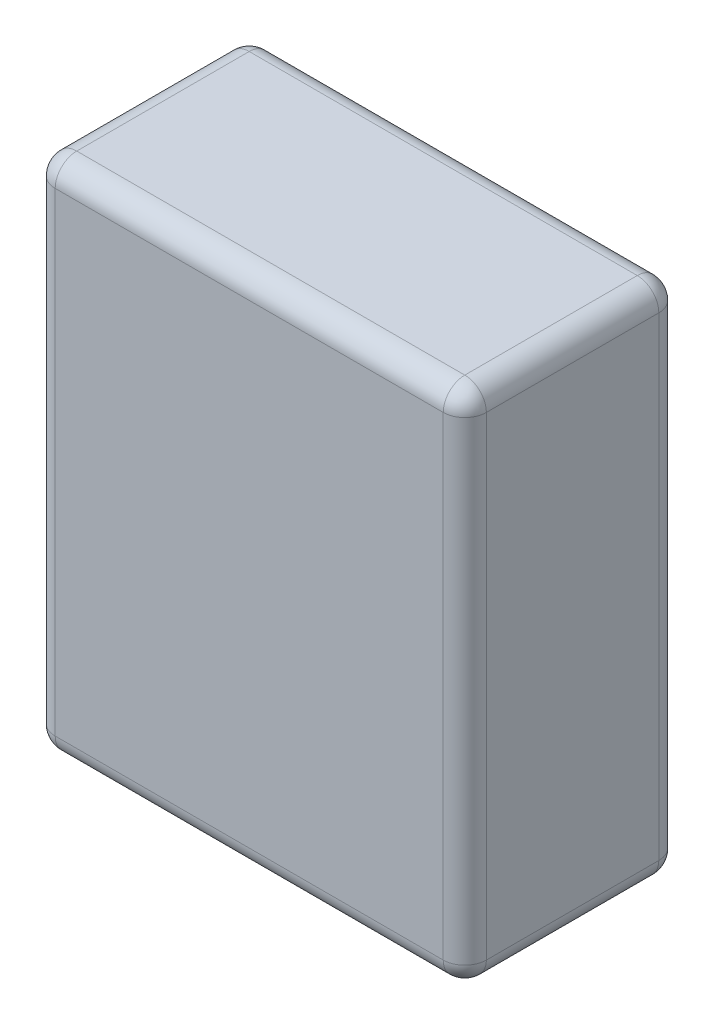
ISO-10303-21;
HEADER;
FILE_DESCRIPTION(('STEP AP214'),'2;1');
FILE_NAME('part.step','',(''),(''),'','','');
FILE_SCHEMA(('AUTOMOTIVE_DESIGN { 1 0 10303 214 1 1 1 1 }'));
ENDSEC;
DATA;
#1=APPLICATION_CONTEXT('core data for automotive mechanical design processes');
#2=APPLICATION_PROTOCOL_DEFINITION('international standard','automotive_design',2000,#1);
#3=PRODUCT_CONTEXT('',#1,'mechanical');
#4=PRODUCT('Part','Part','',(#3));
#5=PRODUCT_RELATED_PRODUCT_CATEGORY('part','',(#4));
#6=PRODUCT_DEFINITION_FORMATION('','',#4);
#7=PRODUCT_DEFINITION_CONTEXT('part definition',#1,'design');
#8=PRODUCT_DEFINITION('design','',#6,#7);
#9=PRODUCT_DEFINITION_SHAPE('','',#8);
#10=(LENGTH_UNIT() NAMED_UNIT(*) SI_UNIT(.MILLI.,.METRE.));
#11=(NAMED_UNIT(*) PLANE_ANGLE_UNIT() SI_UNIT($,.RADIAN.));
#12=(NAMED_UNIT(*) SI_UNIT($,.STERADIAN.) SOLID_ANGLE_UNIT());
#13=UNCERTAINTY_MEASURE_WITH_UNIT(LENGTH_MEASURE(1.E-05),#10,'distance_accuracy_value','');
#14=(GEOMETRIC_REPRESENTATION_CONTEXT(3) GLOBAL_UNCERTAINTY_ASSIGNED_CONTEXT((#13)) GLOBAL_UNIT_ASSIGNED_CONTEXT((#10,
#11,#12)) REPRESENTATION_CONTEXT('',''));
#15=CARTESIAN_POINT('',(0.,0.,0.));
#16=DIRECTION('',(0.,0.,1.));
#17=DIRECTION('',(1.,0.,0.));
#18=AXIS2_PLACEMENT_3D('',#15,#16,#17);
#19=CARTESIAN_POINT('',(5.,6.,5.));
#20=DIRECTION('',(-1.,0.,0.));
#21=DIRECTION('',(0.,0.,1.));
#22=AXIS2_PLACEMENT_3D('',#19,#20,#21);
#23=PLANE('',#22);
#24=DIRECTION('',(0.,1.,0.));
#25=VECTOR('',#24,1.);
#26=CARTESIAN_POINT('',(5.,-6.,4.5));
#27=LINE('',#26,#25);
#28=CARTESIAN_POINT('',(5.,5.5,4.5));
#29=VERTEX_POINT('',#28);
#30=CARTESIAN_POINT('',(5.,-5.5,4.5));
#31=VERTEX_POINT('',#30);
#32=EDGE_CURVE('E195',#29,#31,#27,.F.);
#33=ORIENTED_EDGE('',*,*,#32,.T.);
#34=DIRECTION('',(0.,0.,-1.));
#35=VECTOR('',#34,1.);
#36=CARTESIAN_POINT('',(5.,-5.5,5.));
#37=LINE('',#36,#35);
#38=CARTESIAN_POINT('',(5.,-5.5,0.5));
#39=VERTEX_POINT('',#38);
#40=EDGE_CURVE('E149',#31,#39,#37,.T.);
#41=ORIENTED_EDGE('',*,*,#40,.T.);
#42=DIRECTION('',(0.,1.,0.));
#43=VECTOR('',#42,1.);
#44=CARTESIAN_POINT('',(5.,6.,0.5));
#45=LINE('',#44,#43);
#46=CARTESIAN_POINT('',(5.,5.5,0.5));
#47=VERTEX_POINT('',#46);
#48=EDGE_CURVE('E197',#39,#47,#45,.T.);
#49=ORIENTED_EDGE('',*,*,#48,.T.);
#50=DIRECTION('',(0.,0.,-1.));
#51=VECTOR('',#50,1.);
#52=CARTESIAN_POINT('',(5.,5.5,5.));
#53=LINE('',#52,#51);
#54=EDGE_CURVE('E193',#47,#29,#53,.F.);
#55=ORIENTED_EDGE('',*,*,#54,.T.);
#56=EDGE_LOOP('',(#33,#41,#49,#55));
#57=FACE_BOUND('',#56,.T.);
#58=ADVANCED_FACE('F43',(#57),#23,.F.);
#59=CARTESIAN_POINT('',(-5.,6.,5.));
#60=DIRECTION('',(0.,-1.,0.));
#61=DIRECTION('',(0.,0.,-1.));
#62=AXIS2_PLACEMENT_3D('',#59,#60,#61);
#63=PLANE('',#62);
#64=DIRECTION('',(-1.,0.,0.));
#65=VECTOR('',#64,1.);
#66=CARTESIAN_POINT('',(5.,6.,4.5));
#67=LINE('',#66,#65);
#68=CARTESIAN_POINT('',(-4.5,6.,4.5));
#69=VERTEX_POINT('',#68);
#70=CARTESIAN_POINT('',(4.5,6.,4.5));
#71=VERTEX_POINT('',#70);
#72=EDGE_CURVE('E52',#69,#71,#67,.F.);
#73=ORIENTED_EDGE('',*,*,#72,.T.);
#74=DIRECTION('',(0.,0.,-1.));
#75=VECTOR('',#74,1.);
#76=CARTESIAN_POINT('',(4.5,6.,5.));
#77=LINE('',#76,#75);
#78=CARTESIAN_POINT('',(4.5,6.,0.5));
#79=VERTEX_POINT('',#78);
#80=EDGE_CURVE('E11',#71,#79,#77,.T.);
#81=ORIENTED_EDGE('',*,*,#80,.T.);
#82=DIRECTION('',(-1.,0.,0.));
#83=VECTOR('',#82,1.);
#84=CARTESIAN_POINT('',(-5.,6.,0.5));
#85=LINE('',#84,#83);
#86=CARTESIAN_POINT('',(-4.5,6.,0.5));
#87=VERTEX_POINT('',#86);
#88=EDGE_CURVE('E209',#79,#87,#85,.T.);
#89=ORIENTED_EDGE('',*,*,#88,.T.);
#90=DIRECTION('',(0.,0.,-1.));
#91=VECTOR('',#90,1.);
#92=CARTESIAN_POINT('',(-4.5,6.,5.));
#93=LINE('',#92,#91);
#94=EDGE_CURVE('E63',#87,#69,#93,.F.);
#95=ORIENTED_EDGE('',*,*,#94,.T.);
#96=EDGE_LOOP('',(#73,#81,#89,#95));
#97=FACE_BOUND('',#96,.T.);
#98=ADVANCED_FACE('F282',(#97),#63,.F.);
#99=CARTESIAN_POINT('',(-5.,6.,5.));
#100=DIRECTION('',(1.,0.,0.));
#101=DIRECTION('',(0.,1.,0.));
#102=AXIS2_PLACEMENT_3D('',#99,#100,#101);
#103=PLANE('',#102);
#104=DIRECTION('',(0.,-1.,0.));
#105=VECTOR('',#104,1.);
#106=CARTESIAN_POINT('',(-5.,6.,0.5));
#107=LINE('',#106,#105);
#108=CARTESIAN_POINT('',(-5.,5.5,0.5));
#109=VERTEX_POINT('',#108);
#110=CARTESIAN_POINT('',(-5.,-5.5,0.5));
#111=VERTEX_POINT('',#110);
#112=EDGE_CURVE('E179',#109,#111,#107,.T.);
#113=ORIENTED_EDGE('',*,*,#112,.T.);
#114=DIRECTION('',(0.,0.,-1.));
#115=VECTOR('',#114,1.);
#116=CARTESIAN_POINT('',(-5.,-5.5,5.));
#117=LINE('',#116,#115);
#118=CARTESIAN_POINT('',(-5.,-5.5,4.5));
#119=VERTEX_POINT('',#118);
#120=EDGE_CURVE('E181',#111,#119,#117,.F.);
#121=ORIENTED_EDGE('',*,*,#120,.T.);
#122=DIRECTION('',(0.,-1.,0.));
#123=VECTOR('',#122,1.);
#124=CARTESIAN_POINT('',(-5.,6.,4.5));
#125=LINE('',#124,#123);
#126=CARTESIAN_POINT('',(-5.,5.5,4.5));
#127=VERTEX_POINT('',#126);
#128=EDGE_CURVE('E177',#119,#127,#125,.F.);
#129=ORIENTED_EDGE('',*,*,#128,.T.);
#130=DIRECTION('',(0.,0.,-1.));
#131=VECTOR('',#130,1.);
#132=CARTESIAN_POINT('',(-5.,5.5,5.));
#133=LINE('',#132,#131);
#134=EDGE_CURVE('E175',#127,#109,#133,.T.);
#135=ORIENTED_EDGE('',*,*,#134,.T.);
#136=EDGE_LOOP('',(#113,#121,#129,#135));
#137=FACE_BOUND('',#136,.T.);
#138=ADVANCED_FACE('F342',(#137),#103,.F.);
#139=CARTESIAN_POINT('',(-5.,-6.,5.));
#140=DIRECTION('',(0.,1.,0.));
#141=DIRECTION('',(0.,0.,1.));
#142=AXIS2_PLACEMENT_3D('',#139,#140,#141);
#143=PLANE('',#142);
#144=DIRECTION('',(1.,0.,0.));
#145=VECTOR('',#144,1.);
#146=CARTESIAN_POINT('',(-5.,-6.,4.5));
#147=LINE('',#146,#145);
#148=CARTESIAN_POINT('',(4.5,-6.,4.5));
#149=VERTEX_POINT('',#148);
#150=CARTESIAN_POINT('',(-4.5,-6.,4.5));
#151=VERTEX_POINT('',#150);
#152=EDGE_CURVE('E135',#149,#151,#147,.F.);
#153=ORIENTED_EDGE('',*,*,#152,.T.);
#154=DIRECTION('',(0.,0.,-1.));
#155=VECTOR('',#154,1.);
#156=CARTESIAN_POINT('',(-4.5,-6.,5.));
#157=LINE('',#156,#155);
#158=CARTESIAN_POINT('',(-4.5,-6.,0.5));
#159=VERTEX_POINT('',#158);
#160=EDGE_CURVE('E173',#151,#159,#157,.T.);
#161=ORIENTED_EDGE('',*,*,#160,.T.);
#162=DIRECTION('',(1.,0.,0.));
#163=VECTOR('',#162,1.);
#164=CARTESIAN_POINT('',(-5.,-6.,0.5));
#165=LINE('',#164,#163);
#166=CARTESIAN_POINT('',(4.5,-6.,0.5));
#167=VERTEX_POINT('',#166);
#168=EDGE_CURVE('E138',#159,#167,#165,.T.);
#169=ORIENTED_EDGE('',*,*,#168,.T.);
#170=DIRECTION('',(0.,0.,-1.));
#171=VECTOR('',#170,1.);
#172=CARTESIAN_POINT('',(4.5,-6.,5.));
#173=LINE('',#172,#171);
#174=EDGE_CURVE('E130',#167,#149,#173,.F.);
#175=ORIENTED_EDGE('',*,*,#174,.T.);
#176=EDGE_LOOP('',(#153,#161,#169,#175));
#177=FACE_BOUND('',#176,.T.);
#178=ADVANCED_FACE('F132',(#177),#143,.F.);
#179=CARTESIAN_POINT('',(0.,0.,5.));
#180=DIRECTION('',(0.,0.,1.));
#181=DIRECTION('',(1.,0.,0.));
#182=AXIS2_PLACEMENT_3D('',#179,#180,#181);
#183=PLANE('',#182);
#184=DIRECTION('',(0.,-1.,0.));
#185=VECTOR('',#184,1.);
#186=CARTESIAN_POINT('',(-4.5,-6.,5.));
#187=LINE('',#186,#185);
#188=CARTESIAN_POINT('',(-4.5,5.5,5.));
#189=VERTEX_POINT('',#188);
#190=CARTESIAN_POINT('',(-4.5,-5.5,5.));
#191=VERTEX_POINT('',#190);
#192=EDGE_CURVE('E204',#189,#191,#187,.T.);
#193=ORIENTED_EDGE('',*,*,#192,.T.);
#194=DIRECTION('',(1.,0.,0.));
#195=VECTOR('',#194,1.);
#196=CARTESIAN_POINT('',(5.,-5.5,5.));
#197=LINE('',#196,#195);
#198=CARTESIAN_POINT('',(4.5,-5.5,5.));
#199=VERTEX_POINT('',#198);
#200=EDGE_CURVE('E206',#191,#199,#197,.T.);
#201=ORIENTED_EDGE('',*,*,#200,.T.);
#202=DIRECTION('',(0.,1.,0.));
#203=VECTOR('',#202,1.);
#204=CARTESIAN_POINT('',(4.5,6.,5.));
#205=LINE('',#204,#203);
#206=CARTESIAN_POINT('',(4.5,5.5,5.));
#207=VERTEX_POINT('',#206);
#208=EDGE_CURVE('E202',#199,#207,#205,.T.);
#209=ORIENTED_EDGE('',*,*,#208,.T.);
#210=DIRECTION('',(-1.,0.,0.));
#211=VECTOR('',#210,1.);
#212=CARTESIAN_POINT('',(-5.,5.5,5.));
#213=LINE('',#212,#211);
#214=EDGE_CURVE('E200',#207,#189,#213,.T.);
#215=ORIENTED_EDGE('',*,*,#214,.T.);
#216=EDGE_LOOP('',(#193,#201,#209,#215));
#217=FACE_BOUND('',#216,.T.);
#218=ADVANCED_FACE('F307',(#217),#183,.T.);
#219=CARTESIAN_POINT('',(0.,0.,0.));
#220=DIRECTION('',(0.,0.,1.));
#221=DIRECTION('',(1.,0.,0.));
#222=AXIS2_PLACEMENT_3D('',#219,#220,#221);
#223=PLANE('',#222);
#224=DIRECTION('',(1.,0.,0.));
#225=VECTOR('',#224,1.);
#226=CARTESIAN_POINT('',(0.,-5.5,0.));
#227=LINE('',#226,#225);
#228=CARTESIAN_POINT('',(4.5,-5.5,0.));
#229=VERTEX_POINT('',#228);
#230=CARTESIAN_POINT('',(-4.5,-5.5,0.));
#231=VERTEX_POINT('',#230);
#232=EDGE_CURVE('E188',#229,#231,#227,.F.);
#233=ORIENTED_EDGE('',*,*,#232,.T.);
#234=DIRECTION('',(0.,-1.,0.));
#235=VECTOR('',#234,1.);
#236=CARTESIAN_POINT('',(-4.5,0.,0.));
#237=LINE('',#236,#235);
#238=CARTESIAN_POINT('',(-4.5,5.5,0.));
#239=VERTEX_POINT('',#238);
#240=EDGE_CURVE('E190',#231,#239,#237,.F.);
#241=ORIENTED_EDGE('',*,*,#240,.T.);
#242=DIRECTION('',(-1.,0.,0.));
#243=VECTOR('',#242,1.);
#244=CARTESIAN_POINT('',(0.,5.5,0.));
#245=LINE('',#244,#243);
#246=CARTESIAN_POINT('',(4.5,5.5,0.));
#247=VERTEX_POINT('',#246);
#248=EDGE_CURVE('E184',#239,#247,#245,.F.);
#249=ORIENTED_EDGE('',*,*,#248,.T.);
#250=DIRECTION('',(0.,1.,0.));
#251=VECTOR('',#250,1.);
#252=CARTESIAN_POINT('',(4.5,0.,0.));
#253=LINE('',#252,#251);
#254=EDGE_CURVE('E186',#247,#229,#253,.F.);
#255=ORIENTED_EDGE('',*,*,#254,.T.);
#256=EDGE_LOOP('',(#233,#241,#249,#255));
#257=FACE_BOUND('',#256,.T.);
#258=ADVANCED_FACE('F275',(#257),#223,.F.);
#259=CARTESIAN_POINT('',(4.5,5.5,5.));
#260=DIRECTION('',(0.,0.,-1.));
#261=DIRECTION('',(-1.,0.,0.));
#262=AXIS2_PLACEMENT_3D('',#259,#260,#261);
#263=CYLINDRICAL_SURFACE('',#262,0.5);
#264=CARTESIAN_POINT('',(4.5,5.5,4.5));
#265=DIRECTION('',(0.,0.,1.));
#266=DIRECTION('',(1.,0.,0.));
#267=AXIS2_PLACEMENT_3D('',#264,#265,#266);
#268=CIRCLE('',#267,0.5);
#269=EDGE_CURVE('E47',#29,#71,#268,.T.);
#270=ORIENTED_EDGE('',*,*,#269,.F.);
#271=ORIENTED_EDGE('',*,*,#54,.F.);
#272=CARTESIAN_POINT('',(4.5,5.5,0.5));
#273=DIRECTION('',(0.,0.,-1.));
#274=DIRECTION('',(-1.,0.,0.));
#275=AXIS2_PLACEMENT_3D('',#272,#273,#274);
#276=CIRCLE('',#275,0.5);
#277=EDGE_CURVE('E170',#79,#47,#276,.T.);
#278=ORIENTED_EDGE('',*,*,#277,.F.);
#279=ORIENTED_EDGE('',*,*,#80,.F.);
#280=EDGE_LOOP('',(#270,#271,#278,#279));
#281=FACE_BOUND('',#280,.T.);
#282=ADVANCED_FACE('F45',(#281),#263,.T.);
#283=CARTESIAN_POINT('',(4.5,5.5,4.5));
#284=DIRECTION('',(0.,1.,0.));
#285=DIRECTION('',(-1.,0.,0.));
#286=AXIS2_PLACEMENT_3D('',#283,#284,#285);
#287=SPHERICAL_SURFACE('',#286,0.5);
#288=CARTESIAN_POINT('',(4.5,5.5,4.5));
#289=DIRECTION('',(0.,1.,0.));
#290=DIRECTION('',(0.,0.,1.));
#291=AXIS2_PLACEMENT_3D('',#288,#289,#290);
#292=CIRCLE('',#291,0.5);
#293=EDGE_CURVE('E255',#29,#207,#292,.F.);
#294=ORIENTED_EDGE('',*,*,#293,.F.);
#295=ORIENTED_EDGE('',*,*,#269,.T.);
#296=CARTESIAN_POINT('',(4.5,5.5,4.5));
#297=DIRECTION('',(1.,0.,0.));
#298=DIRECTION('',(0.,0.,-1.));
#299=AXIS2_PLACEMENT_3D('',#296,#297,#298);
#300=CIRCLE('',#299,0.5);
#301=EDGE_CURVE('E258',#207,#71,#300,.F.);
#302=ORIENTED_EDGE('',*,*,#301,.F.);
#303=EDGE_LOOP('',(#294,#295,#302));
#304=FACE_BOUND('',#303,.T.);
#305=ADVANCED_FACE('F300',(#304),#287,.T.);
#306=CARTESIAN_POINT('',(4.5,5.5,0.5));
#307=DIRECTION('',(1.,0.,0.));
#308=DIRECTION('',(0.,0.,-1.));
#309=AXIS2_PLACEMENT_3D('',#306,#307,#308);
#310=SPHERICAL_SURFACE('',#309,0.5);
#311=CARTESIAN_POINT('',(4.5,5.5,0.5));
#312=DIRECTION('',(1.,0.,0.));
#313=DIRECTION('',(0.,1.,0.));
#314=AXIS2_PLACEMENT_3D('',#311,#312,#313);
#315=CIRCLE('',#314,0.5);
#316=EDGE_CURVE('E249',#79,#247,#315,.F.);
#317=ORIENTED_EDGE('',*,*,#316,.F.);
#318=ORIENTED_EDGE('',*,*,#277,.T.);
#319=CARTESIAN_POINT('',(4.5,5.5,0.5));
#320=DIRECTION('',(0.,1.,0.));
#321=DIRECTION('',(0.,0.,1.));
#322=AXIS2_PLACEMENT_3D('',#319,#320,#321);
#323=CIRCLE('',#322,0.5);
#324=EDGE_CURVE('E252',#247,#47,#323,.F.);
#325=ORIENTED_EDGE('',*,*,#324,.F.);
#326=EDGE_LOOP('',(#317,#318,#325));
#327=FACE_BOUND('',#326,.T.);
#328=ADVANCED_FACE('F265',(#327),#310,.T.);
#329=CARTESIAN_POINT('',(0.,5.5,4.5));
#330=DIRECTION('',(1.,0.,0.));
#331=DIRECTION('',(0.,0.,-1.));
#332=AXIS2_PLACEMENT_3D('',#329,#330,#331);
#333=CYLINDRICAL_SURFACE('',#332,0.5);
#334=ORIENTED_EDGE('',*,*,#301,.T.);
#335=ORIENTED_EDGE('',*,*,#72,.F.);
#336=CARTESIAN_POINT('',(-4.5,5.5,4.5));
#337=DIRECTION('',(-1.,0.,0.));
#338=DIRECTION('',(0.,-1.,0.));
#339=AXIS2_PLACEMENT_3D('',#336,#337,#338);
#340=CIRCLE('',#339,0.5);
#341=EDGE_CURVE('E243',#189,#69,#340,.T.);
#342=ORIENTED_EDGE('',*,*,#341,.F.);
#343=ORIENTED_EDGE('',*,*,#214,.F.);
#344=EDGE_LOOP('',(#334,#335,#342,#343));
#345=FACE_BOUND('',#344,.T.);
#346=ADVANCED_FACE('F296',(#345),#333,.T.);
#347=CARTESIAN_POINT('',(4.5,0.,4.5));
#348=DIRECTION('',(0.,-1.,0.));
#349=DIRECTION('',(0.,0.,-1.));
#350=AXIS2_PLACEMENT_3D('',#347,#348,#349);
#351=CYLINDRICAL_SURFACE('',#350,0.5);
#352=ORIENTED_EDGE('',*,*,#293,.T.);
#353=ORIENTED_EDGE('',*,*,#208,.F.);
#354=CARTESIAN_POINT('',(4.5,-5.5,4.5));
#355=DIRECTION('',(0.,-1.,0.));
#356=DIRECTION('',(0.,0.,-1.));
#357=AXIS2_PLACEMENT_3D('',#354,#355,#356);
#358=CIRCLE('',#357,0.5);
#359=EDGE_CURVE('E153',#31,#199,#358,.T.);
#360=ORIENTED_EDGE('',*,*,#359,.F.);
#361=ORIENTED_EDGE('',*,*,#32,.F.);
#362=EDGE_LOOP('',(#352,#353,#360,#361));
#363=FACE_BOUND('',#362,.T.);
#364=ADVANCED_FACE('F305',(#363),#351,.T.);
#365=CARTESIAN_POINT('',(4.5,-5.5,5.));
#366=DIRECTION('',(0.,0.,-1.));
#367=DIRECTION('',(-1.,0.,0.));
#368=AXIS2_PLACEMENT_3D('',#365,#366,#367);
#369=CYLINDRICAL_SURFACE('',#368,0.5);
#370=CARTESIAN_POINT('',(4.5,-5.5,0.5));
#371=DIRECTION('',(0.,0.,-1.));
#372=DIRECTION('',(-1.,0.,0.));
#373=AXIS2_PLACEMENT_3D('',#370,#371,#372);
#374=CIRCLE('',#373,0.5);
#375=EDGE_CURVE('E154',#39,#167,#374,.T.);
#376=ORIENTED_EDGE('',*,*,#375,.F.);
#377=ORIENTED_EDGE('',*,*,#40,.F.);
#378=CARTESIAN_POINT('',(4.5,-5.5,4.5));
#379=DIRECTION('',(0.,0.,1.));
#380=DIRECTION('',(1.,0.,0.));
#381=AXIS2_PLACEMENT_3D('',#378,#379,#380);
#382=CIRCLE('',#381,0.5);
#383=EDGE_CURVE('E145',#149,#31,#382,.T.);
#384=ORIENTED_EDGE('',*,*,#383,.F.);
#385=ORIENTED_EDGE('',*,*,#174,.F.);
#386=EDGE_LOOP('',(#376,#377,#384,#385));
#387=FACE_BOUND('',#386,.T.);
#388=ADVANCED_FACE('F147',(#387),#369,.T.);
#389=CARTESIAN_POINT('',(4.5,6.,0.5));
#390=DIRECTION('',(0.,1.,0.));
#391=DIRECTION('',(0.,0.,1.));
#392=AXIS2_PLACEMENT_3D('',#389,#390,#391);
#393=CYLINDRICAL_SURFACE('',#392,0.5);
#394=ORIENTED_EDGE('',*,*,#324,.T.);
#395=ORIENTED_EDGE('',*,*,#48,.F.);
#396=CARTESIAN_POINT('',(4.5,-5.5,0.5));
#397=DIRECTION('',(0.,-1.,0.));
#398=DIRECTION('',(0.,0.,-1.));
#399=AXIS2_PLACEMENT_3D('',#396,#397,#398);
#400=CIRCLE('',#399,0.5);
#401=EDGE_CURVE('E239',#229,#39,#400,.T.);
#402=ORIENTED_EDGE('',*,*,#401,.F.);
#403=ORIENTED_EDGE('',*,*,#254,.F.);
#404=EDGE_LOOP('',(#394,#395,#402,#403));
#405=FACE_BOUND('',#404,.T.);
#406=ADVANCED_FACE('F271',(#405),#393,.T.);
#407=CARTESIAN_POINT('',(-5.,5.5,0.5));
#408=DIRECTION('',(-1.,0.,0.));
#409=DIRECTION('',(0.,0.,1.));
#410=AXIS2_PLACEMENT_3D('',#407,#408,#409);
#411=CYLINDRICAL_SURFACE('',#410,0.5);
#412=ORIENTED_EDGE('',*,*,#316,.T.);
#413=ORIENTED_EDGE('',*,*,#248,.F.);
#414=CARTESIAN_POINT('',(-4.5,5.5,0.5));
#415=DIRECTION('',(-1.,0.,0.));
#416=DIRECTION('',(0.,0.,1.));
#417=AXIS2_PLACEMENT_3D('',#414,#415,#416);
#418=CIRCLE('',#417,0.5);
#419=EDGE_CURVE('E236',#87,#239,#418,.T.);
#420=ORIENTED_EDGE('',*,*,#419,.F.);
#421=ORIENTED_EDGE('',*,*,#88,.F.);
#422=EDGE_LOOP('',(#412,#413,#420,#421));
#423=FACE_BOUND('',#422,.T.);
#424=ADVANCED_FACE('F281',(#423),#411,.T.);
#425=CARTESIAN_POINT('',(-4.5,5.5,5.));
#426=DIRECTION('',(0.,0.,-1.));
#427=DIRECTION('',(-1.,0.,0.));
#428=AXIS2_PLACEMENT_3D('',#425,#426,#427);
#429=CYLINDRICAL_SURFACE('',#428,0.5);
#430=CARTESIAN_POINT('',(-4.5,5.5,4.5));
#431=DIRECTION('',(0.,0.,1.));
#432=DIRECTION('',(1.,0.,0.));
#433=AXIS2_PLACEMENT_3D('',#430,#431,#432);
#434=CIRCLE('',#433,0.5);
#435=EDGE_CURVE('E246',#69,#127,#434,.T.);
#436=ORIENTED_EDGE('',*,*,#435,.F.);
#437=ORIENTED_EDGE('',*,*,#94,.F.);
#438=CARTESIAN_POINT('',(-4.5,5.5,0.5));
#439=DIRECTION('',(0.,0.,-1.));
#440=DIRECTION('',(-1.,0.,0.));
#441=AXIS2_PLACEMENT_3D('',#438,#439,#440);
#442=CIRCLE('',#441,0.5);
#443=EDGE_CURVE('E233',#109,#87,#442,.T.);
#444=ORIENTED_EDGE('',*,*,#443,.F.);
#445=ORIENTED_EDGE('',*,*,#134,.F.);
#446=EDGE_LOOP('',(#436,#437,#444,#445));
#447=FACE_BOUND('',#446,.T.);
#448=ADVANCED_FACE('F286',(#447),#429,.T.);
#449=CARTESIAN_POINT('',(-4.5,5.5,4.5));
#450=DIRECTION('',(0.,1.,0.));
#451=DIRECTION('',(0.,0.,1.));
#452=AXIS2_PLACEMENT_3D('',#449,#450,#451);
#453=SPHERICAL_SURFACE('',#452,0.5);
#454=ORIENTED_EDGE('',*,*,#341,.T.);
#455=ORIENTED_EDGE('',*,*,#435,.T.);
#456=CARTESIAN_POINT('',(-4.5,5.5,4.5));
#457=DIRECTION('',(0.,1.,0.));
#458=DIRECTION('',(0.,0.,1.));
#459=AXIS2_PLACEMENT_3D('',#456,#457,#458);
#460=CIRCLE('',#459,0.5);
#461=EDGE_CURVE('E161',#189,#127,#460,.F.);
#462=ORIENTED_EDGE('',*,*,#461,.F.);
#463=EDGE_LOOP('',(#454,#455,#462));
#464=FACE_BOUND('',#463,.T.);
#465=ADVANCED_FACE('F292',(#464),#453,.T.);
#466=CARTESIAN_POINT('',(4.5,-5.5,4.5));
#467=DIRECTION('',(1.,0.,0.));
#468=DIRECTION('',(0.,0.,-1.));
#469=AXIS2_PLACEMENT_3D('',#466,#467,#468);
#470=SPHERICAL_SURFACE('',#469,0.5);
#471=ORIENTED_EDGE('',*,*,#383,.T.);
#472=ORIENTED_EDGE('',*,*,#359,.T.);
#473=CARTESIAN_POINT('',(4.5,-5.5,4.5));
#474=DIRECTION('',(1.,0.,0.));
#475=DIRECTION('',(0.,0.,-1.));
#476=AXIS2_PLACEMENT_3D('',#473,#474,#475);
#477=CIRCLE('',#476,0.5);
#478=EDGE_CURVE('E156',#149,#199,#477,.F.);
#479=ORIENTED_EDGE('',*,*,#478,.F.);
#480=EDGE_LOOP('',(#471,#472,#479));
#481=FACE_BOUND('',#480,.T.);
#482=ADVANCED_FACE('F157',(#481),#470,.T.);
#483=CARTESIAN_POINT('',(4.5,-5.5,0.5));
#484=DIRECTION('',(1.,0.,0.));
#485=DIRECTION('',(0.,0.,-1.));
#486=AXIS2_PLACEMENT_3D('',#483,#484,#485);
#487=SPHERICAL_SURFACE('',#486,0.5);
#488=ORIENTED_EDGE('',*,*,#401,.T.);
#489=ORIENTED_EDGE('',*,*,#375,.T.);
#490=CARTESIAN_POINT('',(4.5,-5.5,0.5));
#491=DIRECTION('',(1.,0.,0.));
#492=DIRECTION('',(0.,0.,-1.));
#493=AXIS2_PLACEMENT_3D('',#490,#491,#492);
#494=CIRCLE('',#493,0.5);
#495=EDGE_CURVE('E162',#229,#167,#494,.F.);
#496=ORIENTED_EDGE('',*,*,#495,.F.);
#497=EDGE_LOOP('',(#488,#489,#496));
#498=FACE_BOUND('',#497,.T.);
#499=ADVANCED_FACE('F326',(#498),#487,.T.);
#500=CARTESIAN_POINT('',(-4.5,5.5,0.5));
#501=DIRECTION('',(0.,1.,0.));
#502=DIRECTION('',(0.,0.,1.));
#503=AXIS2_PLACEMENT_3D('',#500,#501,#502);
#504=SPHERICAL_SURFACE('',#503,0.5);
#505=ORIENTED_EDGE('',*,*,#443,.T.);
#506=ORIENTED_EDGE('',*,*,#419,.T.);
#507=CARTESIAN_POINT('',(-4.5,5.5,0.5));
#508=DIRECTION('',(0.,1.,0.));
#509=DIRECTION('',(0.,0.,1.));
#510=AXIS2_PLACEMENT_3D('',#507,#508,#509);
#511=CIRCLE('',#510,0.5);
#512=EDGE_CURVE('E227',#109,#239,#511,.F.);
#513=ORIENTED_EDGE('',*,*,#512,.F.);
#514=EDGE_LOOP('',(#505,#506,#513));
#515=FACE_BOUND('',#514,.T.);
#516=ADVANCED_FACE('F328',(#515),#504,.T.);
#517=CARTESIAN_POINT('',(-4.5,0.,4.5));
#518=DIRECTION('',(0.,1.,0.));
#519=DIRECTION('',(-1.,0.,0.));
#520=AXIS2_PLACEMENT_3D('',#517,#518,#519);
#521=CYLINDRICAL_SURFACE('',#520,0.5);
#522=ORIENTED_EDGE('',*,*,#461,.T.);
#523=ORIENTED_EDGE('',*,*,#128,.F.);
#524=CARTESIAN_POINT('',(-4.5,-5.5,4.5));
#525=DIRECTION('',(0.,-1.,0.));
#526=DIRECTION('',(0.,0.,-1.));
#527=AXIS2_PLACEMENT_3D('',#524,#525,#526);
#528=CIRCLE('',#527,0.5);
#529=EDGE_CURVE('E224',#191,#119,#528,.T.);
#530=ORIENTED_EDGE('',*,*,#529,.F.);
#531=ORIENTED_EDGE('',*,*,#192,.F.);
#532=EDGE_LOOP('',(#522,#523,#530,#531));
#533=FACE_BOUND('',#532,.T.);
#534=ADVANCED_FACE('F311',(#533),#521,.T.);
#535=CARTESIAN_POINT('',(0.,-5.5,4.5));
#536=DIRECTION('',(-1.,0.,0.));
#537=DIRECTION('',(0.,0.,1.));
#538=AXIS2_PLACEMENT_3D('',#535,#536,#537);
#539=CYLINDRICAL_SURFACE('',#538,0.5);
#540=ORIENTED_EDGE('',*,*,#478,.T.);
#541=ORIENTED_EDGE('',*,*,#200,.F.);
#542=CARTESIAN_POINT('',(-4.5,-5.5,4.5));
#543=DIRECTION('',(-1.,0.,0.));
#544=DIRECTION('',(0.,0.,1.));
#545=AXIS2_PLACEMENT_3D('',#542,#543,#544);
#546=CIRCLE('',#545,0.5);
#547=EDGE_CURVE('E166',#151,#191,#546,.T.);
#548=ORIENTED_EDGE('',*,*,#547,.F.);
#549=ORIENTED_EDGE('',*,*,#152,.F.);
#550=EDGE_LOOP('',(#540,#541,#548,#549));
#551=FACE_BOUND('',#550,.T.);
#552=ADVANCED_FACE('F164',(#551),#539,.T.);
#553=CARTESIAN_POINT('',(-5.,-5.5,0.5));
#554=DIRECTION('',(1.,0.,0.));
#555=DIRECTION('',(0.,0.,-1.));
#556=AXIS2_PLACEMENT_3D('',#553,#554,#555);
#557=CYLINDRICAL_SURFACE('',#556,0.5);
#558=ORIENTED_EDGE('',*,*,#495,.T.);
#559=ORIENTED_EDGE('',*,*,#168,.F.);
#560=CARTESIAN_POINT('',(-4.5,-5.5,0.5));
#561=DIRECTION('',(-1.,0.,0.));
#562=DIRECTION('',(0.,0.,1.));
#563=AXIS2_PLACEMENT_3D('',#560,#561,#562);
#564=CIRCLE('',#563,0.5);
#565=EDGE_CURVE('E220',#231,#159,#564,.T.);
#566=ORIENTED_EDGE('',*,*,#565,.F.);
#567=ORIENTED_EDGE('',*,*,#232,.F.);
#568=EDGE_LOOP('',(#558,#559,#566,#567));
#569=FACE_BOUND('',#568,.T.);
#570=ADVANCED_FACE('F324',(#569),#557,.T.);
#571=CARTESIAN_POINT('',(-4.5,6.,0.5));
#572=DIRECTION('',(0.,-1.,0.));
#573=DIRECTION('',(1.,0.,0.));
#574=AXIS2_PLACEMENT_3D('',#571,#572,#573);
#575=CYLINDRICAL_SURFACE('',#574,0.5);
#576=ORIENTED_EDGE('',*,*,#512,.T.);
#577=ORIENTED_EDGE('',*,*,#240,.F.);
#578=CARTESIAN_POINT('',(-4.5,-5.5,0.5));
#579=DIRECTION('',(0.,-1.,0.));
#580=DIRECTION('',(0.,0.,-1.));
#581=AXIS2_PLACEMENT_3D('',#578,#579,#580);
#582=CIRCLE('',#581,0.5);
#583=EDGE_CURVE('E217',#111,#231,#582,.T.);
#584=ORIENTED_EDGE('',*,*,#583,.F.);
#585=ORIENTED_EDGE('',*,*,#112,.F.);
#586=EDGE_LOOP('',(#576,#577,#584,#585));
#587=FACE_BOUND('',#586,.T.);
#588=ADVANCED_FACE('F352',(#587),#575,.T.);
#589=CARTESIAN_POINT('',(-4.5,-5.5,4.5));
#590=DIRECTION('',(0.,0.,1.));
#591=DIRECTION('',(1.,0.,0.));
#592=AXIS2_PLACEMENT_3D('',#589,#590,#591);
#593=SPHERICAL_SURFACE('',#592,0.5);
#594=ORIENTED_EDGE('',*,*,#547,.T.);
#595=ORIENTED_EDGE('',*,*,#529,.T.);
#596=CARTESIAN_POINT('',(-4.5,-5.5,4.5));
#597=DIRECTION('',(0.,0.,1.));
#598=DIRECTION('',(1.,0.,0.));
#599=AXIS2_PLACEMENT_3D('',#596,#597,#598);
#600=CIRCLE('',#599,0.5);
#601=EDGE_CURVE('E215',#151,#119,#600,.F.);
#602=ORIENTED_EDGE('',*,*,#601,.F.);
#603=EDGE_LOOP('',(#594,#595,#602));
#604=FACE_BOUND('',#603,.T.);
#605=ADVANCED_FACE('F313',(#604),#593,.T.);
#606=CARTESIAN_POINT('',(-4.5,-5.5,0.5));
#607=DIRECTION('',(0.,0.,-1.));
#608=DIRECTION('',(-1.,0.,0.));
#609=AXIS2_PLACEMENT_3D('',#606,#607,#608);
#610=SPHERICAL_SURFACE('',#609,0.5);
#611=ORIENTED_EDGE('',*,*,#583,.T.);
#612=ORIENTED_EDGE('',*,*,#565,.T.);
#613=CARTESIAN_POINT('',(-4.5,-5.5,0.5));
#614=DIRECTION('',(0.,0.,-1.));
#615=DIRECTION('',(-1.,0.,0.));
#616=AXIS2_PLACEMENT_3D('',#613,#614,#615);
#617=CIRCLE('',#616,0.5);
#618=EDGE_CURVE('E213',#111,#159,#617,.F.);
#619=ORIENTED_EDGE('',*,*,#618,.F.);
#620=EDGE_LOOP('',(#611,#612,#619));
#621=FACE_BOUND('',#620,.T.);
#622=ADVANCED_FACE('F321',(#621),#610,.T.);
#623=CARTESIAN_POINT('',(-4.5,-5.5,5.));
#624=DIRECTION('',(0.,0.,-1.));
#625=DIRECTION('',(-1.,0.,0.));
#626=AXIS2_PLACEMENT_3D('',#623,#624,#625);
#627=CYLINDRICAL_SURFACE('',#626,0.5);
#628=ORIENTED_EDGE('',*,*,#601,.T.);
#629=ORIENTED_EDGE('',*,*,#120,.F.);
#630=ORIENTED_EDGE('',*,*,#618,.T.);
#631=ORIENTED_EDGE('',*,*,#160,.F.);
#632=EDGE_LOOP('',(#628,#629,#630,#631));
#633=FACE_BOUND('',#632,.T.);
#634=ADVANCED_FACE('F317',(#633),#627,.T.);
#635=CLOSED_SHELL('',(#58,#98,#138,#178,#218,#258,#282,#305,#328,#346,#364,#388,#406,#424,#448,
#465,#482,#499,#516,#534,#552,#570,#588,#605,#622,#634));
#636=MANIFOLD_SOLID_BREP('B2',#635);
#637=ADVANCED_BREP_SHAPE_REPRESENTATION('',(#18,#636),#14);
#638=SHAPE_DEFINITION_REPRESENTATION(#9,#637);
ENDSEC;
END-ISO-10303-21;
